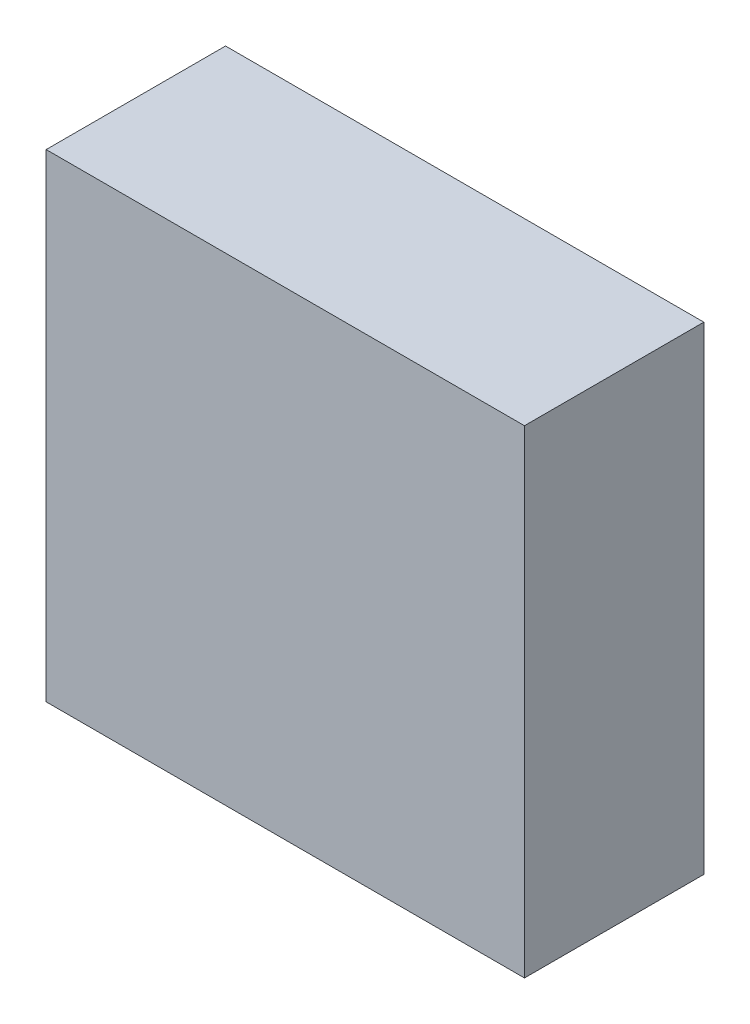
ISO-10303-21;
HEADER;
FILE_DESCRIPTION(('STEP AP214'),'2;1');
FILE_NAME('part.step','',(''),(''),'','','');
FILE_SCHEMA(('AUTOMOTIVE_DESIGN { 1 0 10303 214 1 1 1 1 }'));
ENDSEC;
DATA;
#1=APPLICATION_CONTEXT('core data for automotive mechanical design processes');
#2=APPLICATION_PROTOCOL_DEFINITION('international standard','automotive_design',2000,#1);
#3=PRODUCT_CONTEXT('',#1,'mechanical');
#4=PRODUCT('Part','Part','',(#3));
#5=PRODUCT_RELATED_PRODUCT_CATEGORY('part','',(#4));
#6=PRODUCT_DEFINITION_FORMATION('','',#4);
#7=PRODUCT_DEFINITION_CONTEXT('part definition',#1,'design');
#8=PRODUCT_DEFINITION('design','',#6,#7);
#9=PRODUCT_DEFINITION_SHAPE('','',#8);
#10=(LENGTH_UNIT() NAMED_UNIT(*) SI_UNIT(.MILLI.,.METRE.));
#11=(NAMED_UNIT(*) PLANE_ANGLE_UNIT() SI_UNIT($,.RADIAN.));
#12=(NAMED_UNIT(*) SI_UNIT($,.STERADIAN.) SOLID_ANGLE_UNIT());
#13=UNCERTAINTY_MEASURE_WITH_UNIT(LENGTH_MEASURE(1.E-05),#10,'distance_accuracy_value','');
#14=(GEOMETRIC_REPRESENTATION_CONTEXT(3) GLOBAL_UNCERTAINTY_ASSIGNED_CONTEXT((#13)) GLOBAL_UNIT_ASSIGNED_CONTEXT((#10,
#11,#12)) REPRESENTATION_CONTEXT('',''));
#15=CARTESIAN_POINT('',(0.,0.,0.));
#16=DIRECTION('',(0.,0.,1.));
#17=DIRECTION('',(1.,0.,0.));
#18=AXIS2_PLACEMENT_3D('',#15,#16,#17);
#19=CARTESIAN_POINT('',(-3.60524304322998,4.24106466571338,3.));
#20=DIRECTION('',(1.,0.,0.));
#21=DIRECTION('',(0.,0.,-1.));
#22=AXIS2_PLACEMENT_3D('',#19,#20,#21);
#23=PLANE('',#22);
#24=DIRECTION('',(0.,-1.,0.));
#25=VECTOR('',#24,1.);
#26=CARTESIAN_POINT('',(-3.60524304322998,4.24106466571338,0.));
#27=LINE('',#26,#25);
#28=CARTESIAN_POINT('',(-3.60524304322998,4.24106466571338,0.));
#29=VERTEX_POINT('',#28);
#30=CARTESIAN_POINT('',(-3.60524304322998,-3.75893533428662,0.));
#31=VERTEX_POINT('',#30);
#32=EDGE_CURVE('E107',#29,#31,#27,.T.);
#33=ORIENTED_EDGE('',*,*,#32,.T.);
#34=DIRECTION('',(0.,0.,-1.));
#35=VECTOR('',#34,1.);
#36=CARTESIAN_POINT('',(-3.60524304322998,-3.75893533428662,3.));
#37=LINE('',#36,#35);
#38=CARTESIAN_POINT('',(-3.60524304322998,-3.75893533428662,3.));
#39=VERTEX_POINT('',#38);
#40=EDGE_CURVE('E11',#39,#31,#37,.T.);
#41=ORIENTED_EDGE('',*,*,#40,.F.);
#42=DIRECTION('',(0.,-1.,0.));
#43=VECTOR('',#42,1.);
#44=CARTESIAN_POINT('',(-3.60524304322998,4.24106466571338,3.));
#45=LINE('',#44,#43);
#46=CARTESIAN_POINT('',(-3.60524304322998,4.24106466571338,3.));
#47=VERTEX_POINT('',#46);
#48=EDGE_CURVE('E91',#47,#39,#45,.T.);
#49=ORIENTED_EDGE('',*,*,#48,.F.);
#50=DIRECTION('',(0.,0.,-1.));
#51=VECTOR('',#50,1.);
#52=CARTESIAN_POINT('',(-3.60524304322998,4.24106466571338,3.));
#53=LINE('',#52,#51);
#54=EDGE_CURVE('E103',#47,#29,#53,.T.);
#55=ORIENTED_EDGE('',*,*,#54,.T.);
#56=EDGE_LOOP('',(#33,#41,#49,#55));
#57=FACE_BOUND('',#56,.T.);
#58=ADVANCED_FACE('F39',(#57),#23,.F.);
#59=CARTESIAN_POINT('',(-3.60524304322998,-3.75893533428662,3.));
#60=DIRECTION('',(0.,1.,0.));
#61=DIRECTION('',(0.,0.,1.));
#62=AXIS2_PLACEMENT_3D('',#59,#60,#61);
#63=PLANE('',#62);
#64=DIRECTION('',(1.,0.,0.));
#65=VECTOR('',#64,1.);
#66=CARTESIAN_POINT('',(-3.60524304322998,-3.75893533428662,0.));
#67=LINE('',#66,#65);
#68=CARTESIAN_POINT('',(4.39475695677002,-3.75893533428662,0.));
#69=VERTEX_POINT('',#68);
#70=EDGE_CURVE('E96',#31,#69,#67,.T.);
#71=ORIENTED_EDGE('',*,*,#70,.T.);
#72=DIRECTION('',(0.,0.,-1.));
#73=VECTOR('',#72,1.);
#74=CARTESIAN_POINT('',(4.39475695677002,-3.75893533428662,3.));
#75=LINE('',#74,#73);
#76=CARTESIAN_POINT('',(4.39475695677002,-3.75893533428662,3.));
#77=VERTEX_POINT('',#76);
#78=EDGE_CURVE('E48',#77,#69,#75,.T.);
#79=ORIENTED_EDGE('',*,*,#78,.F.);
#80=DIRECTION('',(1.,0.,0.));
#81=VECTOR('',#80,1.);
#82=CARTESIAN_POINT('',(-3.60524304322998,-3.75893533428662,3.));
#83=LINE('',#82,#81);
#84=EDGE_CURVE('E86',#39,#77,#83,.T.);
#85=ORIENTED_EDGE('',*,*,#84,.F.);
#86=ORIENTED_EDGE('',*,*,#40,.T.);
#87=EDGE_LOOP('',(#71,#79,#85,#86));
#88=FACE_BOUND('',#87,.T.);
#89=ADVANCED_FACE('F95',(#88),#63,.F.);
#90=CARTESIAN_POINT('',(4.39475695677002,4.24106466571338,3.));
#91=DIRECTION('',(-1.,0.,0.));
#92=DIRECTION('',(0.,-1.,0.));
#93=AXIS2_PLACEMENT_3D('',#90,#91,#92);
#94=PLANE('',#93);
#95=DIRECTION('',(0.,1.,0.));
#96=VECTOR('',#95,1.);
#97=CARTESIAN_POINT('',(4.39475695677002,4.24106466571338,0.));
#98=LINE('',#97,#96);
#99=CARTESIAN_POINT('',(4.39475695677002,4.24106466571338,0.));
#100=VERTEX_POINT('',#99);
#101=EDGE_CURVE('E73',#69,#100,#98,.T.);
#102=ORIENTED_EDGE('',*,*,#101,.T.);
#103=DIRECTION('',(0.,0.,-1.));
#104=VECTOR('',#103,1.);
#105=CARTESIAN_POINT('',(4.39475695677002,4.24106466571338,3.));
#106=LINE('',#105,#104);
#107=CARTESIAN_POINT('',(4.39475695677002,4.24106466571338,3.));
#108=VERTEX_POINT('',#107);
#109=EDGE_CURVE('E98',#108,#100,#106,.T.);
#110=ORIENTED_EDGE('',*,*,#109,.F.);
#111=DIRECTION('',(0.,1.,0.));
#112=VECTOR('',#111,1.);
#113=CARTESIAN_POINT('',(4.39475695677002,4.24106466571338,3.));
#114=LINE('',#113,#112);
#115=EDGE_CURVE('E89',#77,#108,#114,.T.);
#116=ORIENTED_EDGE('',*,*,#115,.F.);
#117=ORIENTED_EDGE('',*,*,#78,.T.);
#118=EDGE_LOOP('',(#102,#110,#116,#117));
#119=FACE_BOUND('',#118,.T.);
#120=ADVANCED_FACE('F99',(#119),#94,.F.);
#121=CARTESIAN_POINT('',(-3.60524304322998,4.24106466571338,3.));
#122=DIRECTION('',(0.,-1.,0.));
#123=DIRECTION('',(0.,0.,-1.));
#124=AXIS2_PLACEMENT_3D('',#121,#122,#123);
#125=PLANE('',#124);
#126=DIRECTION('',(-1.,0.,0.));
#127=VECTOR('',#126,1.);
#128=CARTESIAN_POINT('',(-3.60524304322998,4.24106466571338,0.));
#129=LINE('',#128,#127);
#130=EDGE_CURVE('E79',#100,#29,#129,.T.);
#131=ORIENTED_EDGE('',*,*,#130,.T.);
#132=ORIENTED_EDGE('',*,*,#54,.F.);
#133=DIRECTION('',(-1.,0.,0.));
#134=VECTOR('',#133,1.);
#135=CARTESIAN_POINT('',(-3.60524304322998,4.24106466571338,3.));
#136=LINE('',#135,#134);
#137=EDGE_CURVE('E56',#108,#47,#136,.T.);
#138=ORIENTED_EDGE('',*,*,#137,.F.);
#139=ORIENTED_EDGE('',*,*,#109,.T.);
#140=EDGE_LOOP('',(#131,#132,#138,#139));
#141=FACE_BOUND('',#140,.T.);
#142=ADVANCED_FACE('F120',(#141),#125,.F.);
#143=CARTESIAN_POINT('',(0.,0.,3.));
#144=DIRECTION('',(0.,0.,1.));
#145=DIRECTION('',(1.,0.,0.));
#146=AXIS2_PLACEMENT_3D('',#143,#144,#145);
#147=PLANE('',#146);
#148=ORIENTED_EDGE('',*,*,#48,.T.);
#149=ORIENTED_EDGE('',*,*,#84,.T.);
#150=ORIENTED_EDGE('',*,*,#115,.T.);
#151=ORIENTED_EDGE('',*,*,#137,.T.);
#152=EDGE_LOOP('',(#148,#149,#150,#151));
#153=FACE_BOUND('',#152,.T.);
#154=ADVANCED_FACE('F87',(#153),#147,.T.);
#155=CARTESIAN_POINT('',(0.,0.,0.));
#156=DIRECTION('',(0.,0.,1.));
#157=DIRECTION('',(1.,0.,0.));
#158=AXIS2_PLACEMENT_3D('',#155,#156,#157);
#159=PLANE('',#158);
#160=ORIENTED_EDGE('',*,*,#32,.F.);
#161=ORIENTED_EDGE('',*,*,#130,.F.);
#162=ORIENTED_EDGE('',*,*,#101,.F.);
#163=ORIENTED_EDGE('',*,*,#70,.F.);
#164=EDGE_LOOP('',(#160,#161,#162,#163));
#165=FACE_BOUND('',#164,.T.);
#166=ADVANCED_FACE('F123',(#165),#159,.F.);
#167=CLOSED_SHELL('',(#58,#89,#120,#142,#154,#166));
#168=MANIFOLD_SOLID_BREP('B2',#167);
#169=ADVANCED_BREP_SHAPE_REPRESENTATION('',(#18,#168),#14);
#170=SHAPE_DEFINITION_REPRESENTATION(#9,#169);
ENDSEC;
END-ISO-10303-21;
